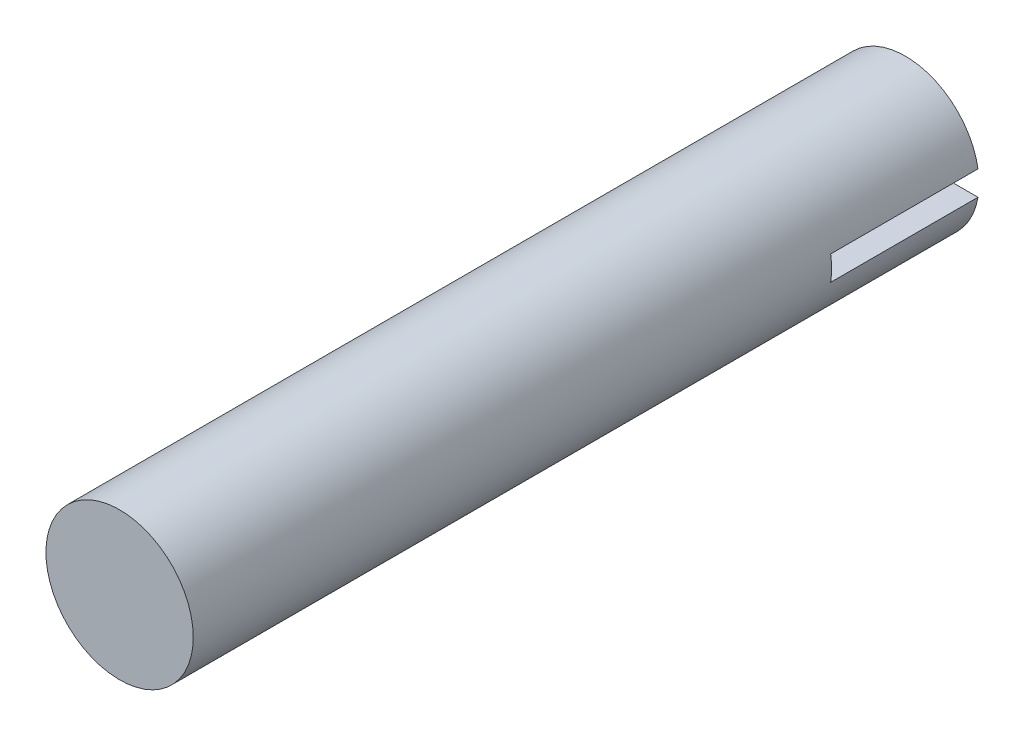
ISO-10303-21;
HEADER;
FILE_DESCRIPTION(('STEP AP214'),'2;1');
FILE_NAME('part.step','',(''),(''),'','','');
FILE_SCHEMA(('AUTOMOTIVE_DESIGN { 1 0 10303 214 1 1 1 1 }'));
ENDSEC;
DATA;
#1=APPLICATION_CONTEXT('core data for automotive mechanical design processes');
#2=APPLICATION_PROTOCOL_DEFINITION('international standard','automotive_design',2000,#1);
#3=PRODUCT_CONTEXT('',#1,'mechanical');
#4=PRODUCT('Part','Part','',(#3));
#5=PRODUCT_RELATED_PRODUCT_CATEGORY('part','',(#4));
#6=PRODUCT_DEFINITION_FORMATION('','',#4);
#7=PRODUCT_DEFINITION_CONTEXT('part definition',#1,'design');
#8=PRODUCT_DEFINITION('design','',#6,#7);
#9=PRODUCT_DEFINITION_SHAPE('','',#8);
#10=(LENGTH_UNIT() NAMED_UNIT(*) SI_UNIT(.MILLI.,.METRE.));
#11=(NAMED_UNIT(*) PLANE_ANGLE_UNIT() SI_UNIT($,.RADIAN.));
#12=(NAMED_UNIT(*) SI_UNIT($,.STERADIAN.) SOLID_ANGLE_UNIT());
#13=UNCERTAINTY_MEASURE_WITH_UNIT(LENGTH_MEASURE(1.E-05),#10,'distance_accuracy_value','');
#14=(GEOMETRIC_REPRESENTATION_CONTEXT(3) GLOBAL_UNCERTAINTY_ASSIGNED_CONTEXT((#13)) GLOBAL_UNIT_ASSIGNED_CONTEXT((#10,
#11,#12)) REPRESENTATION_CONTEXT('',''));
#15=CARTESIAN_POINT('',(0.,0.,0.));
#16=DIRECTION('',(0.,0.,1.));
#17=DIRECTION('',(1.,0.,0.));
#18=AXIS2_PLACEMENT_3D('',#15,#16,#17);
#19=CARTESIAN_POINT('',(0.,0.,0.));
#20=DIRECTION('',(0.,0.,1.));
#21=DIRECTION('',(1.,0.,0.));
#22=AXIS2_PLACEMENT_3D('',#19,#20,#21);
#23=PLANE('',#22);
#24=CARTESIAN_POINT('',(0.,0.,0.));
#25=DIRECTION('',(0.,0.,1.));
#26=DIRECTION('',(1.,0.,0.));
#27=AXIS2_PLACEMENT_3D('',#24,#25,#26);
#28=CIRCLE('',#27,1.5);
#29=CARTESIAN_POINT('',(1.4790199457749,0.25,0.));
#30=VERTEX_POINT('',#29);
#31=CARTESIAN_POINT('',(-1.4790199457749,0.25,0.));
#32=VERTEX_POINT('',#31);
#33=EDGE_CURVE('E76',#30,#32,#28,.T.);
#34=ORIENTED_EDGE('',*,*,#33,.F.);
#35=DIRECTION('',(-1.,0.,0.));
#36=VECTOR('',#35,1.);
#37=CARTESIAN_POINT('',(0.,0.25,0.));
#38=LINE('',#37,#36);
#39=EDGE_CURVE('E64',#30,#32,#38,.T.);
#40=ORIENTED_EDGE('',*,*,#39,.T.);
#41=EDGE_LOOP('',(#34,#40));
#42=FACE_BOUND('',#41,.T.);
#43=ADVANCED_FACE('F17',(#42),#23,.F.);
#44=CARTESIAN_POINT('',(0.,0.,16.));
#45=DIRECTION('',(0.,0.,-1.));
#46=DIRECTION('',(-1.,0.,0.));
#47=AXIS2_PLACEMENT_3D('',#44,#45,#46);
#48=CYLINDRICAL_SURFACE('',#47,1.5);
#49=CARTESIAN_POINT('',(0.,0.,3.));
#50=DIRECTION('',(0.,0.,-1.));
#51=DIRECTION('',(-1.,0.,0.));
#52=AXIS2_PLACEMENT_3D('',#49,#50,#51);
#53=CIRCLE('',#52,1.5);
#54=CARTESIAN_POINT('',(1.4790199457749,0.25,3.));
#55=VERTEX_POINT('',#54);
#56=CARTESIAN_POINT('',(1.4790199457749,-0.25,3.));
#57=VERTEX_POINT('',#56);
#58=EDGE_CURVE('E11',#55,#57,#53,.T.);
#59=ORIENTED_EDGE('',*,*,#58,.F.);
#60=DIRECTION('',(0.,0.,-1.));
#61=VECTOR('',#60,1.);
#62=CARTESIAN_POINT('',(1.4790199457749,0.25,16.));
#63=LINE('',#62,#61);
#64=EDGE_CURVE('E40',#55,#30,#63,.T.);
#65=ORIENTED_EDGE('',*,*,#64,.T.);
#66=ORIENTED_EDGE('',*,*,#33,.T.);
#67=DIRECTION('',(0.,0.,-1.));
#68=VECTOR('',#67,1.);
#69=CARTESIAN_POINT('',(-1.4790199457749,0.25,16.));
#70=LINE('',#69,#68);
#71=CARTESIAN_POINT('',(-1.4790199457749,0.25,3.));
#72=VERTEX_POINT('',#71);
#73=EDGE_CURVE('E73',#32,#72,#70,.F.);
#74=ORIENTED_EDGE('',*,*,#73,.T.);
#75=CARTESIAN_POINT('',(-1.4790199457749,-0.25,3.));
#76=VERTEX_POINT('',#75);
#77=EDGE_CURVE('E21',#76,#72,#53,.T.);
#78=ORIENTED_EDGE('',*,*,#77,.F.);
#79=DIRECTION('',(0.,0.,-1.));
#80=VECTOR('',#79,1.);
#81=CARTESIAN_POINT('',(-1.4790199457749,-0.25,16.));
#82=LINE('',#81,#80);
#83=CARTESIAN_POINT('',(-1.4790199457749,-0.25,0.));
#84=VERTEX_POINT('',#83);
#85=EDGE_CURVE('E59',#76,#84,#82,.T.);
#86=ORIENTED_EDGE('',*,*,#85,.T.);
#87=CARTESIAN_POINT('',(1.4790199457749,-0.25,0.));
#88=VERTEX_POINT('',#87);
#89=EDGE_CURVE('E71',#84,#88,#28,.T.);
#90=ORIENTED_EDGE('',*,*,#89,.T.);
#91=DIRECTION('',(0.,0.,-1.));
#92=VECTOR('',#91,1.);
#93=CARTESIAN_POINT('',(1.4790199457749,-0.25,16.));
#94=LINE('',#93,#92);
#95=EDGE_CURVE('E32',#88,#57,#94,.F.);
#96=ORIENTED_EDGE('',*,*,#95,.T.);
#97=EDGE_LOOP('',(#59,#65,#66,#74,#78,#86,#90,#96));
#98=FACE_BOUND('',#97,.T.);
#99=CARTESIAN_POINT('',(0.,0.,16.));
#100=DIRECTION('',(0.,0.,1.));
#101=DIRECTION('',(1.,0.,0.));
#102=AXIS2_PLACEMENT_3D('',#99,#100,#101);
#103=CIRCLE('',#102,1.5);
#104=CARTESIAN_POINT('',(1.5,0.,16.));
#105=VERTEX_POINT('',#104);
#106=EDGE_CURVE('E65',#105,#105,#103,.T.);
#107=ORIENTED_EDGE('',*,*,#106,.F.);
#108=EDGE_LOOP('',(#107));
#109=FACE_BOUND('',#108,.T.);
#110=ADVANCED_FACE('F19',(#98,#109),#48,.T.);
#111=CARTESIAN_POINT('',(0.,0.,16.));
#112=DIRECTION('',(0.,0.,1.));
#113=DIRECTION('',(1.,0.,0.));
#114=AXIS2_PLACEMENT_3D('',#111,#112,#113);
#115=PLANE('',#114);
#116=ORIENTED_EDGE('',*,*,#106,.T.);
#117=EDGE_LOOP('',(#116));
#118=FACE_BOUND('',#117,.T.);
#119=ADVANCED_FACE('F99',(#118),#115,.T.);
#120=ORIENTED_EDGE('',*,*,#89,.F.);
#121=DIRECTION('',(1.,0.,0.));
#122=VECTOR('',#121,1.);
#123=CARTESIAN_POINT('',(0.,-0.25,0.));
#124=LINE('',#123,#122);
#125=EDGE_CURVE('E56',#84,#88,#124,.T.);
#126=ORIENTED_EDGE('',*,*,#125,.T.);
#127=EDGE_LOOP('',(#120,#126));
#128=FACE_BOUND('',#127,.T.);
#129=ADVANCED_FACE('F75',(#128),#23,.F.);
#130=CARTESIAN_POINT('',(0.,0.,3.));
#131=DIRECTION('',(0.,0.,-1.));
#132=DIRECTION('',(-1.,0.,0.));
#133=AXIS2_PLACEMENT_3D('',#130,#131,#132);
#134=PLANE('',#133);
#135=ORIENTED_EDGE('',*,*,#58,.T.);
#136=DIRECTION('',(-1.,0.,0.));
#137=VECTOR('',#136,1.);
#138=CARTESIAN_POINT('',(-2.050303712036,-0.25,3.));
#139=LINE('',#138,#137);
#140=EDGE_CURVE('E87',#57,#76,#139,.T.);
#141=ORIENTED_EDGE('',*,*,#140,.T.);
#142=ORIENTED_EDGE('',*,*,#77,.T.);
#143=DIRECTION('',(1.,0.,0.));
#144=VECTOR('',#143,1.);
#145=CARTESIAN_POINT('',(-2.050303712036,0.25,3.));
#146=LINE('',#145,#144);
#147=EDGE_CURVE('E86',#72,#55,#146,.T.);
#148=ORIENTED_EDGE('',*,*,#147,.T.);
#149=EDGE_LOOP('',(#135,#141,#142,#148));
#150=FACE_BOUND('',#149,.T.);
#151=ADVANCED_FACE('F85',(#150),#134,.T.);
#152=CARTESIAN_POINT('',(-2.050303712036,0.25,3.));
#153=DIRECTION('',(0.,1.,0.));
#154=DIRECTION('',(-1.,0.,0.));
#155=AXIS2_PLACEMENT_3D('',#152,#153,#154);
#156=PLANE('',#155);
#157=ORIENTED_EDGE('',*,*,#147,.F.);
#158=ORIENTED_EDGE('',*,*,#73,.F.);
#159=ORIENTED_EDGE('',*,*,#39,.F.);
#160=ORIENTED_EDGE('',*,*,#64,.F.);
#161=EDGE_LOOP('',(#157,#158,#159,#160));
#162=FACE_BOUND('',#161,.T.);
#163=ADVANCED_FACE('F88',(#162),#156,.F.);
#164=CARTESIAN_POINT('',(-2.050303712036,-0.25,3.));
#165=DIRECTION('',(0.,-1.,0.));
#166=DIRECTION('',(1.,0.,0.));
#167=AXIS2_PLACEMENT_3D('',#164,#165,#166);
#168=PLANE('',#167);
#169=ORIENTED_EDGE('',*,*,#140,.F.);
#170=ORIENTED_EDGE('',*,*,#95,.F.);
#171=ORIENTED_EDGE('',*,*,#125,.F.);
#172=ORIENTED_EDGE('',*,*,#85,.F.);
#173=EDGE_LOOP('',(#169,#170,#171,#172));
#174=FACE_BOUND('',#173,.T.);
#175=ADVANCED_FACE('F58',(#174),#168,.F.);
#176=CLOSED_SHELL('',(#43,#110,#119,#129,#151,#163,#175));
#177=MANIFOLD_SOLID_BREP('B1',#176);
#178=ADVANCED_BREP_SHAPE_REPRESENTATION('',(#18,#177),#14);
#179=SHAPE_DEFINITION_REPRESENTATION(#9,#178);
ENDSEC;
END-ISO-10303-21;
